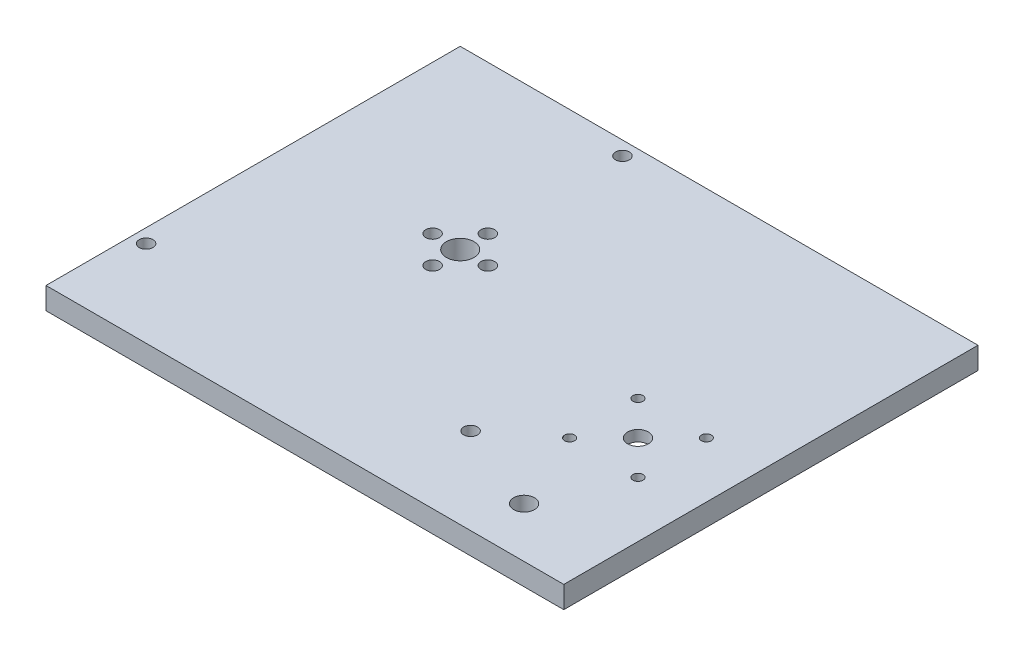
ISO-10303-21;
HEADER;
FILE_DESCRIPTION(('STEP AP214'),'2;1');
FILE_NAME('part.step','',(''),(''),'','','');
FILE_SCHEMA(('AUTOMOTIVE_DESIGN { 1 0 10303 214 1 1 1 1 }'));
ENDSEC;
DATA;
#1=APPLICATION_CONTEXT('core data for automotive mechanical design processes');
#2=APPLICATION_PROTOCOL_DEFINITION('international standard','automotive_design',2000,#1);
#3=PRODUCT_CONTEXT('',#1,'mechanical');
#4=PRODUCT('Part','Part','',(#3));
#5=PRODUCT_RELATED_PRODUCT_CATEGORY('part','',(#4));
#6=PRODUCT_DEFINITION_FORMATION('','',#4);
#7=PRODUCT_DEFINITION_CONTEXT('part definition',#1,'design');
#8=PRODUCT_DEFINITION('design','',#6,#7);
#9=PRODUCT_DEFINITION_SHAPE('','',#8);
#10=(LENGTH_UNIT() NAMED_UNIT(*) SI_UNIT(.MILLI.,.METRE.));
#11=(NAMED_UNIT(*) PLANE_ANGLE_UNIT() SI_UNIT($,.RADIAN.));
#12=(NAMED_UNIT(*) SI_UNIT($,.STERADIAN.) SOLID_ANGLE_UNIT());
#13=UNCERTAINTY_MEASURE_WITH_UNIT(LENGTH_MEASURE(1.E-05),#10,'distance_accuracy_value','');
#14=(GEOMETRIC_REPRESENTATION_CONTEXT(3) GLOBAL_UNCERTAINTY_ASSIGNED_CONTEXT((#13)) GLOBAL_UNIT_ASSIGNED_CONTEXT((#10,
#11,#12)) REPRESENTATION_CONTEXT('',''));
#15=CARTESIAN_POINT('',(0.,0.,0.));
#16=DIRECTION('',(0.,0.,1.));
#17=DIRECTION('',(1.,0.,0.));
#18=AXIS2_PLACEMENT_3D('',#15,#16,#17);
#19=CARTESIAN_POINT('',(124.,-3.65,-47.5));
#20=DIRECTION('',(0.,1.,0.));
#21=DIRECTION('',(0.,0.,1.));
#22=AXIS2_PLACEMENT_3D('',#19,#20,#21);
#23=CYLINDRICAL_SURFACE('',#22,2.99999999999999);
#24=CARTESIAN_POINT('',(124.,6.35,-47.5));
#25=DIRECTION('',(0.,1.,0.));
#26=DIRECTION('',(0.,0.,1.));
#27=AXIS2_PLACEMENT_3D('',#24,#25,#26);
#28=CIRCLE('',#27,2.99999999999999);
#29=CARTESIAN_POINT('',(124.,6.35,-44.5));
#30=VERTEX_POINT('',#29);
#31=EDGE_CURVE('E243',#30,#30,#28,.T.);
#32=ORIENTED_EDGE('',*,*,#31,.T.);
#33=EDGE_LOOP('',(#32));
#34=FACE_BOUND('',#33,.T.);
#35=CARTESIAN_POINT('',(124.,3.21,-47.5));
#36=DIRECTION('',(0.,-1.,0.));
#37=DIRECTION('',(0.,0.,-1.));
#38=AXIS2_PLACEMENT_3D('',#35,#36,#37);
#39=CIRCLE('',#38,2.99999999999999);
#40=CARTESIAN_POINT('',(124.,3.21,-50.5));
#41=VERTEX_POINT('',#40);
#42=EDGE_CURVE('E42',#41,#41,#39,.F.);
#43=ORIENTED_EDGE('',*,*,#42,.F.);
#44=EDGE_LOOP('',(#43));
#45=FACE_BOUND('',#44,.T.);
#46=ADVANCED_FACE('F38',(#34,#45),#23,.F.);
#47=CARTESIAN_POINT('',(0.,6.35,0.));
#48=DIRECTION('',(1.,0.,0.));
#49=DIRECTION('',(0.,0.,-1.));
#50=AXIS2_PLACEMENT_3D('',#47,#48,#49);
#51=PLANE('',#50);
#52=DIRECTION('',(0.,0.,1.));
#53=VECTOR('',#52,1.);
#54=CARTESIAN_POINT('',(0.,0.,0.));
#55=LINE('',#54,#53);
#56=CARTESIAN_POINT('',(0.,0.,-120.));
#57=VERTEX_POINT('',#56);
#58=CARTESIAN_POINT('',(0.,0.,0.));
#59=VERTEX_POINT('',#58);
#60=EDGE_CURVE('E110',#57,#59,#55,.T.);
#61=ORIENTED_EDGE('',*,*,#60,.T.);
#62=DIRECTION('',(0.,-1.,0.));
#63=VECTOR('',#62,1.);
#64=CARTESIAN_POINT('',(0.,6.35,0.));
#65=LINE('',#64,#63);
#66=CARTESIAN_POINT('',(0.,6.35,0.));
#67=VERTEX_POINT('',#66);
#68=EDGE_CURVE('E11',#67,#59,#65,.T.);
#69=ORIENTED_EDGE('',*,*,#68,.F.);
#70=DIRECTION('',(0.,0.,1.));
#71=VECTOR('',#70,1.);
#72=CARTESIAN_POINT('',(0.,6.35,0.));
#73=LINE('',#72,#71);
#74=CARTESIAN_POINT('',(0.,6.35,-120.));
#75=VERTEX_POINT('',#74);
#76=EDGE_CURVE('E93',#75,#67,#73,.T.);
#77=ORIENTED_EDGE('',*,*,#76,.F.);
#78=DIRECTION('',(0.,-1.,0.));
#79=VECTOR('',#78,1.);
#80=CARTESIAN_POINT('',(0.,6.35,-120.));
#81=LINE('',#80,#79);
#82=EDGE_CURVE('E106',#75,#57,#81,.T.);
#83=ORIENTED_EDGE('',*,*,#82,.T.);
#84=EDGE_LOOP('',(#61,#69,#77,#83));
#85=FACE_BOUND('',#84,.T.);
#86=ADVANCED_FACE('F40',(#85),#51,.F.);
#87=CARTESIAN_POINT('',(0.,6.35,0.));
#88=DIRECTION('',(0.,0.,-1.));
#89=DIRECTION('',(-1.,0.,0.));
#90=AXIS2_PLACEMENT_3D('',#87,#88,#89);
#91=PLANE('',#90);
#92=DIRECTION('',(1.,0.,0.));
#93=VECTOR('',#92,1.);
#94=CARTESIAN_POINT('',(0.,0.,0.));
#95=LINE('',#94,#93);
#96=CARTESIAN_POINT('',(150.,0.,0.));
#97=VERTEX_POINT('',#96);
#98=EDGE_CURVE('E98',#59,#97,#95,.T.);
#99=ORIENTED_EDGE('',*,*,#98,.T.);
#100=DIRECTION('',(0.,-1.,0.));
#101=VECTOR('',#100,1.);
#102=CARTESIAN_POINT('',(150.,6.35,0.));
#103=LINE('',#102,#101);
#104=CARTESIAN_POINT('',(150.,6.35,0.));
#105=VERTEX_POINT('',#104);
#106=EDGE_CURVE('E49',#105,#97,#103,.T.);
#107=ORIENTED_EDGE('',*,*,#106,.F.);
#108=DIRECTION('',(1.,0.,0.));
#109=VECTOR('',#108,1.);
#110=CARTESIAN_POINT('',(0.,6.35,0.));
#111=LINE('',#110,#109);
#112=EDGE_CURVE('E88',#67,#105,#111,.T.);
#113=ORIENTED_EDGE('',*,*,#112,.F.);
#114=ORIENTED_EDGE('',*,*,#68,.T.);
#115=EDGE_LOOP('',(#99,#107,#113,#114));
#116=FACE_BOUND('',#115,.T.);
#117=ADVANCED_FACE('F97',(#116),#91,.F.);
#118=CARTESIAN_POINT('',(150.,6.35,0.));
#119=DIRECTION('',(-1.,0.,0.));
#120=DIRECTION('',(0.,0.,1.));
#121=AXIS2_PLACEMENT_3D('',#118,#119,#120);
#122=PLANE('',#121);
#123=DIRECTION('',(0.,0.,-1.));
#124=VECTOR('',#123,1.);
#125=CARTESIAN_POINT('',(150.,0.,0.));
#126=LINE('',#125,#124);
#127=CARTESIAN_POINT('',(150.,0.,-120.));
#128=VERTEX_POINT('',#127);
#129=EDGE_CURVE('E75',#97,#128,#126,.T.);
#130=ORIENTED_EDGE('',*,*,#129,.T.);
#131=DIRECTION('',(0.,-1.,0.));
#132=VECTOR('',#131,1.);
#133=CARTESIAN_POINT('',(150.,6.35,-120.));
#134=LINE('',#133,#132);
#135=CARTESIAN_POINT('',(150.,6.35,-120.));
#136=VERTEX_POINT('',#135);
#137=EDGE_CURVE('E100',#136,#128,#134,.T.);
#138=ORIENTED_EDGE('',*,*,#137,.F.);
#139=DIRECTION('',(0.,0.,-1.));
#140=VECTOR('',#139,1.);
#141=CARTESIAN_POINT('',(150.,6.35,0.));
#142=LINE('',#141,#140);
#143=EDGE_CURVE('E91',#105,#136,#142,.T.);
#144=ORIENTED_EDGE('',*,*,#143,.F.);
#145=ORIENTED_EDGE('',*,*,#106,.T.);
#146=EDGE_LOOP('',(#130,#138,#144,#145));
#147=FACE_BOUND('',#146,.T.);
#148=ADVANCED_FACE('F102',(#147),#122,.F.);
#149=CARTESIAN_POINT('',(0.,6.35,-120.));
#150=DIRECTION('',(0.,0.,1.));
#151=DIRECTION('',(1.,0.,0.));
#152=AXIS2_PLACEMENT_3D('',#149,#150,#151);
#153=PLANE('',#152);
#154=DIRECTION('',(-1.,0.,0.));
#155=VECTOR('',#154,1.);
#156=CARTESIAN_POINT('',(0.,0.,-120.));
#157=LINE('',#156,#155);
#158=EDGE_CURVE('E81',#128,#57,#157,.T.);
#159=ORIENTED_EDGE('',*,*,#158,.T.);
#160=ORIENTED_EDGE('',*,*,#82,.F.);
#161=DIRECTION('',(-1.,0.,0.));
#162=VECTOR('',#161,1.);
#163=CARTESIAN_POINT('',(0.,6.35,-120.));
#164=LINE('',#163,#162);
#165=EDGE_CURVE('E58',#136,#75,#164,.T.);
#166=ORIENTED_EDGE('',*,*,#165,.F.);
#167=ORIENTED_EDGE('',*,*,#137,.T.);
#168=EDGE_LOOP('',(#159,#160,#166,#167));
#169=FACE_BOUND('',#168,.T.);
#170=ADVANCED_FACE('F188',(#169),#153,.F.);
#171=CARTESIAN_POINT('',(0.,6.35,0.));
#172=DIRECTION('',(0.,-1.,0.));
#173=DIRECTION('',(0.,0.,-1.));
#174=AXIS2_PLACEMENT_3D('',#171,#172,#173);
#175=PLANE('',#174);
#176=CARTESIAN_POINT('',(114.100505063388,6.35,-57.3994949366116));
#177=DIRECTION('',(0.,1.,0.));
#178=DIRECTION('',(0.,0.,1.));
#179=AXIS2_PLACEMENT_3D('',#176,#177,#178);
#180=CIRCLE('',#179,1.44999999999998);
#181=CARTESIAN_POINT('',(114.100505063388,6.35,-55.9494949366116));
#182=VERTEX_POINT('',#181);
#183=EDGE_CURVE('E295',#182,#182,#180,.T.);
#184=ORIENTED_EDGE('',*,*,#183,.F.);
#185=EDGE_LOOP('',(#184));
#186=FACE_BOUND('',#185,.T.);
#187=CARTESIAN_POINT('',(133.899494936612,6.35,-37.6005050633883));
#188=DIRECTION('',(0.,1.,0.));
#189=DIRECTION('',(0.,0.,1.));
#190=AXIS2_PLACEMENT_3D('',#187,#188,#189);
#191=CIRCLE('',#190,1.45);
#192=CARTESIAN_POINT('',(133.899494936612,6.35,-36.1505050633883));
#193=VERTEX_POINT('',#192);
#194=EDGE_CURVE('E303',#193,#193,#191,.T.);
#195=ORIENTED_EDGE('',*,*,#194,.F.);
#196=EDGE_LOOP('',(#195));
#197=FACE_BOUND('',#196,.T.);
#198=CARTESIAN_POINT('',(114.100505063388,6.35,-37.6005050633883));
#199=DIRECTION('',(0.,1.,0.));
#200=DIRECTION('',(0.,0.,1.));
#201=AXIS2_PLACEMENT_3D('',#198,#199,#200);
#202=CIRCLE('',#201,1.44999999999998);
#203=CARTESIAN_POINT('',(114.100505063388,6.35,-36.1505050633883));
#204=VERTEX_POINT('',#203);
#205=EDGE_CURVE('E287',#204,#204,#202,.T.);
#206=ORIENTED_EDGE('',*,*,#205,.F.);
#207=EDGE_LOOP('',(#206));
#208=FACE_BOUND('',#207,.T.);
#209=CARTESIAN_POINT('',(133.899494936612,6.35,-57.3994949366116));
#210=DIRECTION('',(0.,1.,0.));
#211=DIRECTION('',(0.,0.,1.));
#212=AXIS2_PLACEMENT_3D('',#209,#210,#211);
#213=CIRCLE('',#212,1.45);
#214=CARTESIAN_POINT('',(133.899494936612,6.35,-55.9494949366116));
#215=VERTEX_POINT('',#214);
#216=EDGE_CURVE('E283',#215,#215,#213,.T.);
#217=ORIENTED_EDGE('',*,*,#216,.F.);
#218=EDGE_LOOP('',(#217));
#219=FACE_BOUND('',#218,.T.);
#220=CARTESIAN_POINT('',(51.,6.35,-116.));
#221=DIRECTION('',(0.,1.,0.));
#222=DIRECTION('',(0.,0.,1.));
#223=AXIS2_PLACEMENT_3D('',#220,#221,#222);
#224=CIRCLE('',#223,2.);
#225=CARTESIAN_POINT('',(51.,6.35,-114.));
#226=VERTEX_POINT('',#225);
#227=EDGE_CURVE('E130',#226,#226,#224,.T.);
#228=ORIENTED_EDGE('',*,*,#227,.F.);
#229=EDGE_LOOP('',(#228));
#230=FACE_BOUND('',#229,.T.);
#231=CARTESIAN_POINT('',(51.0000000000001,6.35,-60.9999999999999));
#232=DIRECTION('',(0.,1.,0.));
#233=DIRECTION('',(0.,0.,1.));
#234=AXIS2_PLACEMENT_3D('',#231,#232,#233);
#235=CIRCLE('',#234,2.);
#236=CARTESIAN_POINT('',(51.0000000000001,6.35,-58.9999999999999));
#237=VERTEX_POINT('',#236);
#238=EDGE_CURVE('E252',#237,#237,#235,.T.);
#239=ORIENTED_EDGE('',*,*,#238,.F.);
#240=EDGE_LOOP('',(#239));
#241=FACE_BOUND('',#240,.T.);
#242=CARTESIAN_POINT('',(51.,6.35,-76.9999999999999));
#243=DIRECTION('',(0.,1.,0.));
#244=DIRECTION('',(0.,0.,1.));
#245=AXIS2_PLACEMENT_3D('',#242,#243,#244);
#246=CIRCLE('',#245,1.99999999999999);
#247=CARTESIAN_POINT('',(51.,6.35,-74.9999999999999));
#248=VERTEX_POINT('',#247);
#249=EDGE_CURVE('E237',#248,#248,#246,.T.);
#250=ORIENTED_EDGE('',*,*,#249,.F.);
#251=EDGE_LOOP('',(#250));
#252=FACE_BOUND('',#251,.T.);
#253=CARTESIAN_POINT('',(43.,6.35,-68.9999999999998));
#254=DIRECTION('',(0.,1.,0.));
#255=DIRECTION('',(0.,0.,1.));
#256=AXIS2_PLACEMENT_3D('',#253,#254,#255);
#257=CIRCLE('',#256,2.);
#258=CARTESIAN_POINT('',(43.,6.35,-66.9999999999998));
#259=VERTEX_POINT('',#258);
#260=EDGE_CURVE('E234',#259,#259,#257,.T.);
#261=ORIENTED_EDGE('',*,*,#260,.F.);
#262=EDGE_LOOP('',(#261));
#263=FACE_BOUND('',#262,.T.);
#264=CARTESIAN_POINT('',(51.,6.35,-68.9999999999999));
#265=DIRECTION('',(0.,1.,0.));
#266=DIRECTION('',(0.,0.,1.));
#267=AXIS2_PLACEMENT_3D('',#264,#265,#266);
#268=CIRCLE('',#267,4.00000000000001);
#269=CARTESIAN_POINT('',(51.,6.35,-64.9999999999999));
#270=VERTEX_POINT('',#269);
#271=EDGE_CURVE('E238',#270,#270,#268,.T.);
#272=ORIENTED_EDGE('',*,*,#271,.F.);
#273=EDGE_LOOP('',(#272));
#274=FACE_BOUND('',#273,.T.);
#275=CARTESIAN_POINT('',(59.,6.35,-68.9999999999999));
#276=DIRECTION('',(0.,1.,0.));
#277=DIRECTION('',(0.,0.,1.));
#278=AXIS2_PLACEMENT_3D('',#275,#276,#277);
#279=CIRCLE('',#278,2.);
#280=CARTESIAN_POINT('',(59.,6.35,-66.9999999999999));
#281=VERTEX_POINT('',#280);
#282=EDGE_CURVE('E246',#281,#281,#279,.T.);
#283=ORIENTED_EDGE('',*,*,#282,.F.);
#284=EDGE_LOOP('',(#283));
#285=FACE_BOUND('',#284,.T.);
#286=ORIENTED_EDGE('',*,*,#31,.F.);
#287=EDGE_LOOP('',(#286));
#288=FACE_BOUND('',#287,.T.);
#289=CARTESIAN_POINT('',(124.,6.35,-14.5));
#290=DIRECTION('',(0.,1.,0.));
#291=DIRECTION('',(0.,0.,1.));
#292=AXIS2_PLACEMENT_3D('',#289,#290,#291);
#293=CIRCLE('',#292,2.99999999999999);
#294=CARTESIAN_POINT('',(124.,6.35,-11.5));
#295=VERTEX_POINT('',#294);
#296=EDGE_CURVE('E256',#295,#295,#293,.T.);
#297=ORIENTED_EDGE('',*,*,#296,.F.);
#298=EDGE_LOOP('',(#297));
#299=FACE_BOUND('',#298,.T.);
#300=CARTESIAN_POINT('',(98.,6.35,-25.));
#301=DIRECTION('',(0.,1.,0.));
#302=DIRECTION('',(0.,0.,1.));
#303=AXIS2_PLACEMENT_3D('',#300,#301,#302);
#304=CIRCLE('',#303,2.);
#305=CARTESIAN_POINT('',(98.,6.35,-23.));
#306=VERTEX_POINT('',#305);
#307=EDGE_CURVE('E260',#306,#306,#304,.T.);
#308=ORIENTED_EDGE('',*,*,#307,.F.);
#309=EDGE_LOOP('',(#308));
#310=FACE_BOUND('',#309,.T.);
#311=CARTESIAN_POINT('',(4.00000000000002,6.35,-25.));
#312=DIRECTION('',(0.,1.,0.));
#313=DIRECTION('',(0.,0.,1.));
#314=AXIS2_PLACEMENT_3D('',#311,#312,#313);
#315=CIRCLE('',#314,2.);
#316=CARTESIAN_POINT('',(4.00000000000002,6.35,-23.));
#317=VERTEX_POINT('',#316);
#318=EDGE_CURVE('E264',#317,#317,#315,.T.);
#319=ORIENTED_EDGE('',*,*,#318,.F.);
#320=EDGE_LOOP('',(#319));
#321=FACE_BOUND('',#320,.T.);
#322=ORIENTED_EDGE('',*,*,#76,.T.);
#323=ORIENTED_EDGE('',*,*,#112,.T.);
#324=ORIENTED_EDGE('',*,*,#143,.T.);
#325=ORIENTED_EDGE('',*,*,#165,.T.);
#326=EDGE_LOOP('',(#322,#323,#324,#325));
#327=FACE_BOUND('',#326,.T.);
#328=ADVANCED_FACE('F89',(#186,#197,#208,#219,#230,#241,#252,#263,#274,#285,#288,#299,#310,#321,
#327),#175,.F.);
#329=CARTESIAN_POINT('',(0.,0.,0.));
#330=DIRECTION('',(0.,-1.,0.));
#331=DIRECTION('',(0.,0.,-1.));
#332=AXIS2_PLACEMENT_3D('',#329,#330,#331);
#333=PLANE('',#332);
#334=CARTESIAN_POINT('',(114.100505063388,0.,-57.3994949366116));
#335=DIRECTION('',(0.,1.,0.));
#336=DIRECTION('',(0.,0.,1.));
#337=AXIS2_PLACEMENT_3D('',#334,#335,#336);
#338=CIRCLE('',#337,1.44999999999998);
#339=CARTESIAN_POINT('',(114.100505063388,0.,-55.9494949366116));
#340=VERTEX_POINT('',#339);
#341=EDGE_CURVE('E291',#340,#340,#338,.T.);
#342=ORIENTED_EDGE('',*,*,#341,.T.);
#343=EDGE_LOOP('',(#342));
#344=FACE_BOUND('',#343,.T.);
#345=CARTESIAN_POINT('',(133.899494936612,0.,-37.6005050633883));
#346=DIRECTION('',(0.,1.,0.));
#347=DIRECTION('',(0.,0.,1.));
#348=AXIS2_PLACEMENT_3D('',#345,#346,#347);
#349=CIRCLE('',#348,1.45);
#350=CARTESIAN_POINT('',(133.899494936612,0.,-36.1505050633883));
#351=VERTEX_POINT('',#350);
#352=EDGE_CURVE('E299',#351,#351,#349,.T.);
#353=ORIENTED_EDGE('',*,*,#352,.T.);
#354=EDGE_LOOP('',(#353));
#355=FACE_BOUND('',#354,.T.);
#356=CARTESIAN_POINT('',(114.100505063388,0.,-37.6005050633883));
#357=DIRECTION('',(0.,1.,0.));
#358=DIRECTION('',(0.,0.,1.));
#359=AXIS2_PLACEMENT_3D('',#356,#357,#358);
#360=CIRCLE('',#359,1.44999999999998);
#361=CARTESIAN_POINT('',(114.100505063388,0.,-36.1505050633883));
#362=VERTEX_POINT('',#361);
#363=EDGE_CURVE('E307',#362,#362,#360,.T.);
#364=ORIENTED_EDGE('',*,*,#363,.T.);
#365=EDGE_LOOP('',(#364));
#366=FACE_BOUND('',#365,.T.);
#367=CARTESIAN_POINT('',(133.899494936612,0.,-57.3994949366116));
#368=DIRECTION('',(0.,1.,0.));
#369=DIRECTION('',(0.,0.,1.));
#370=AXIS2_PLACEMENT_3D('',#367,#368,#369);
#371=CIRCLE('',#370,1.45);
#372=CARTESIAN_POINT('',(133.899494936612,0.,-55.9494949366116));
#373=VERTEX_POINT('',#372);
#374=EDGE_CURVE('E279',#373,#373,#371,.T.);
#375=ORIENTED_EDGE('',*,*,#374,.T.);
#376=EDGE_LOOP('',(#375));
#377=FACE_BOUND('',#376,.T.);
#378=CARTESIAN_POINT('',(124.,0.,-47.5));
#379=DIRECTION('',(0.,-1.,0.));
#380=DIRECTION('',(0.,0.,-1.));
#381=AXIS2_PLACEMENT_3D('',#378,#379,#380);
#382=CIRCLE('',#381,11.);
#383=CARTESIAN_POINT('',(124.,0.,-58.5));
#384=VERTEX_POINT('',#383);
#385=EDGE_CURVE('E274',#384,#384,#382,.T.);
#386=ORIENTED_EDGE('',*,*,#385,.F.);
#387=EDGE_LOOP('',(#386));
#388=FACE_BOUND('',#387,.T.);
#389=CARTESIAN_POINT('',(51.,0.,-116.));
#390=DIRECTION('',(0.,-1.,0.));
#391=DIRECTION('',(0.,0.,-1.));
#392=AXIS2_PLACEMENT_3D('',#389,#390,#391);
#393=CIRCLE('',#392,2.);
#394=CARTESIAN_POINT('',(51.,0.,-118.));
#395=VERTEX_POINT('',#394);
#396=EDGE_CURVE('E114',#395,#395,#393,.T.);
#397=ORIENTED_EDGE('',*,*,#396,.F.);
#398=EDGE_LOOP('',(#397));
#399=FACE_BOUND('',#398,.T.);
#400=CARTESIAN_POINT('',(51.0000000000001,0.,-60.9999999999999));
#401=DIRECTION('',(0.,-1.,0.));
#402=DIRECTION('',(0.,0.,-1.));
#403=AXIS2_PLACEMENT_3D('',#400,#401,#402);
#404=CIRCLE('',#403,2.);
#405=CARTESIAN_POINT('',(51.0000000000001,0.,-62.9999999999999));
#406=VERTEX_POINT('',#405);
#407=EDGE_CURVE('E154',#406,#406,#404,.T.);
#408=ORIENTED_EDGE('',*,*,#407,.F.);
#409=EDGE_LOOP('',(#408));
#410=FACE_BOUND('',#409,.T.);
#411=CARTESIAN_POINT('',(51.,0.,-76.9999999999999));
#412=DIRECTION('',(0.,-1.,0.));
#413=DIRECTION('',(0.,0.,-1.));
#414=AXIS2_PLACEMENT_3D('',#411,#412,#413);
#415=CIRCLE('',#414,1.99999999999999);
#416=CARTESIAN_POINT('',(51.,0.,-78.9999999999999));
#417=VERTEX_POINT('',#416);
#418=EDGE_CURVE('E150',#417,#417,#415,.T.);
#419=ORIENTED_EDGE('',*,*,#418,.F.);
#420=EDGE_LOOP('',(#419));
#421=FACE_BOUND('',#420,.T.);
#422=CARTESIAN_POINT('',(43.,0.,-68.9999999999998));
#423=DIRECTION('',(0.,-1.,0.));
#424=DIRECTION('',(0.,0.,-1.));
#425=AXIS2_PLACEMENT_3D('',#422,#423,#424);
#426=CIRCLE('',#425,2.);
#427=CARTESIAN_POINT('',(43.,0.,-70.9999999999998));
#428=VERTEX_POINT('',#427);
#429=EDGE_CURVE('E146',#428,#428,#426,.T.);
#430=ORIENTED_EDGE('',*,*,#429,.F.);
#431=EDGE_LOOP('',(#430));
#432=FACE_BOUND('',#431,.T.);
#433=CARTESIAN_POINT('',(51.,0.,-68.9999999999999));
#434=DIRECTION('',(0.,-1.,0.));
#435=DIRECTION('',(0.,0.,-1.));
#436=AXIS2_PLACEMENT_3D('',#433,#434,#435);
#437=CIRCLE('',#436,4.00000000000001);
#438=CARTESIAN_POINT('',(51.,0.,-72.9999999999999));
#439=VERTEX_POINT('',#438);
#440=EDGE_CURVE('E142',#439,#439,#437,.T.);
#441=ORIENTED_EDGE('',*,*,#440,.F.);
#442=EDGE_LOOP('',(#441));
#443=FACE_BOUND('',#442,.T.);
#444=CARTESIAN_POINT('',(59.,0.,-68.9999999999999));
#445=DIRECTION('',(0.,-1.,0.));
#446=DIRECTION('',(0.,0.,-1.));
#447=AXIS2_PLACEMENT_3D('',#444,#445,#446);
#448=CIRCLE('',#447,2.);
#449=CARTESIAN_POINT('',(59.,0.,-70.9999999999999));
#450=VERTEX_POINT('',#449);
#451=EDGE_CURVE('E138',#450,#450,#448,.T.);
#452=ORIENTED_EDGE('',*,*,#451,.F.);
#453=EDGE_LOOP('',(#452));
#454=FACE_BOUND('',#453,.T.);
#455=CARTESIAN_POINT('',(124.,0.,-14.5));
#456=DIRECTION('',(0.,-1.,0.));
#457=DIRECTION('',(0.,0.,-1.));
#458=AXIS2_PLACEMENT_3D('',#455,#456,#457);
#459=CIRCLE('',#458,2.99999999999999);
#460=CARTESIAN_POINT('',(124.,0.,-17.5));
#461=VERTEX_POINT('',#460);
#462=EDGE_CURVE('E134',#461,#461,#459,.T.);
#463=ORIENTED_EDGE('',*,*,#462,.F.);
#464=EDGE_LOOP('',(#463));
#465=FACE_BOUND('',#464,.T.);
#466=CARTESIAN_POINT('',(98.,0.,-25.));
#467=DIRECTION('',(0.,-1.,0.));
#468=DIRECTION('',(0.,0.,-1.));
#469=AXIS2_PLACEMENT_3D('',#466,#467,#468);
#470=CIRCLE('',#469,2.);
#471=CARTESIAN_POINT('',(98.,0.,-27.));
#472=VERTEX_POINT('',#471);
#473=EDGE_CURVE('E129',#472,#472,#470,.T.);
#474=ORIENTED_EDGE('',*,*,#473,.F.);
#475=EDGE_LOOP('',(#474));
#476=FACE_BOUND('',#475,.T.);
#477=CARTESIAN_POINT('',(4.00000000000002,0.,-25.));
#478=DIRECTION('',(0.,-1.,0.));
#479=DIRECTION('',(0.,0.,-1.));
#480=AXIS2_PLACEMENT_3D('',#477,#478,#479);
#481=CIRCLE('',#480,2.);
#482=CARTESIAN_POINT('',(4.00000000000002,0.,-27.));
#483=VERTEX_POINT('',#482);
#484=EDGE_CURVE('E125',#483,#483,#481,.T.);
#485=ORIENTED_EDGE('',*,*,#484,.F.);
#486=EDGE_LOOP('',(#485));
#487=FACE_BOUND('',#486,.T.);
#488=ORIENTED_EDGE('',*,*,#60,.F.);
#489=ORIENTED_EDGE('',*,*,#158,.F.);
#490=ORIENTED_EDGE('',*,*,#129,.F.);
#491=ORIENTED_EDGE('',*,*,#98,.F.);
#492=EDGE_LOOP('',(#488,#489,#490,#491));
#493=FACE_BOUND('',#492,.T.);
#494=ADVANCED_FACE('F164',(#344,#355,#366,#377,#388,#399,#410,#421,#432,#443,#454,#465,#476,
#487,#493),#333,.T.);
#495=CARTESIAN_POINT('',(4.00000000000002,-3.65,-25.));
#496=DIRECTION('',(0.,1.,0.));
#497=DIRECTION('',(0.,0.,1.));
#498=AXIS2_PLACEMENT_3D('',#495,#496,#497);
#499=CYLINDRICAL_SURFACE('',#498,2.);
#500=ORIENTED_EDGE('',*,*,#484,.T.);
#501=EDGE_LOOP('',(#500));
#502=FACE_BOUND('',#501,.T.);
#503=ORIENTED_EDGE('',*,*,#318,.T.);
#504=EDGE_LOOP('',(#503));
#505=FACE_BOUND('',#504,.T.);
#506=ADVANCED_FACE('F167',(#502,#505),#499,.F.);
#507=CARTESIAN_POINT('',(98.,-3.65,-25.));
#508=DIRECTION('',(0.,1.,0.));
#509=DIRECTION('',(0.,0.,1.));
#510=AXIS2_PLACEMENT_3D('',#507,#508,#509);
#511=CYLINDRICAL_SURFACE('',#510,2.);
#512=ORIENTED_EDGE('',*,*,#473,.T.);
#513=EDGE_LOOP('',(#512));
#514=FACE_BOUND('',#513,.T.);
#515=ORIENTED_EDGE('',*,*,#307,.T.);
#516=EDGE_LOOP('',(#515));
#517=FACE_BOUND('',#516,.T.);
#518=ADVANCED_FACE('F338',(#514,#517),#511,.F.);
#519=CARTESIAN_POINT('',(124.,-3.65,-14.5));
#520=DIRECTION('',(0.,1.,0.));
#521=DIRECTION('',(0.,0.,1.));
#522=AXIS2_PLACEMENT_3D('',#519,#520,#521);
#523=CYLINDRICAL_SURFACE('',#522,2.99999999999999);
#524=ORIENTED_EDGE('',*,*,#462,.T.);
#525=EDGE_LOOP('',(#524));
#526=FACE_BOUND('',#525,.T.);
#527=ORIENTED_EDGE('',*,*,#296,.T.);
#528=EDGE_LOOP('',(#527));
#529=FACE_BOUND('',#528,.T.);
#530=ADVANCED_FACE('F211',(#526,#529),#523,.F.);
#531=CARTESIAN_POINT('',(59.,-3.65,-68.9999999999999));
#532=DIRECTION('',(0.,1.,0.));
#533=DIRECTION('',(0.,0.,1.));
#534=AXIS2_PLACEMENT_3D('',#531,#532,#533);
#535=CYLINDRICAL_SURFACE('',#534,2.);
#536=ORIENTED_EDGE('',*,*,#451,.T.);
#537=EDGE_LOOP('',(#536));
#538=FACE_BOUND('',#537,.T.);
#539=ORIENTED_EDGE('',*,*,#282,.T.);
#540=EDGE_LOOP('',(#539));
#541=FACE_BOUND('',#540,.T.);
#542=ADVANCED_FACE('F217',(#538,#541),#535,.F.);
#543=CARTESIAN_POINT('',(51.,-3.65,-68.9999999999999));
#544=DIRECTION('',(0.,1.,0.));
#545=DIRECTION('',(0.,0.,1.));
#546=AXIS2_PLACEMENT_3D('',#543,#544,#545);
#547=CYLINDRICAL_SURFACE('',#546,4.00000000000001);
#548=ORIENTED_EDGE('',*,*,#440,.T.);
#549=EDGE_LOOP('',(#548));
#550=FACE_BOUND('',#549,.T.);
#551=ORIENTED_EDGE('',*,*,#271,.T.);
#552=EDGE_LOOP('',(#551));
#553=FACE_BOUND('',#552,.T.);
#554=ADVANCED_FACE('F213',(#550,#553),#547,.F.);
#555=CARTESIAN_POINT('',(43.,-3.65,-68.9999999999998));
#556=DIRECTION('',(0.,1.,0.));
#557=DIRECTION('',(0.,0.,1.));
#558=AXIS2_PLACEMENT_3D('',#555,#556,#557);
#559=CYLINDRICAL_SURFACE('',#558,2.);
#560=ORIENTED_EDGE('',*,*,#429,.T.);
#561=EDGE_LOOP('',(#560));
#562=FACE_BOUND('',#561,.T.);
#563=ORIENTED_EDGE('',*,*,#260,.T.);
#564=EDGE_LOOP('',(#563));
#565=FACE_BOUND('',#564,.T.);
#566=ADVANCED_FACE('F216',(#562,#565),#559,.F.);
#567=CARTESIAN_POINT('',(51.,-3.65,-76.9999999999999));
#568=DIRECTION('',(0.,1.,0.));
#569=DIRECTION('',(0.,0.,1.));
#570=AXIS2_PLACEMENT_3D('',#567,#568,#569);
#571=CYLINDRICAL_SURFACE('',#570,1.99999999999999);
#572=ORIENTED_EDGE('',*,*,#418,.T.);
#573=EDGE_LOOP('',(#572));
#574=FACE_BOUND('',#573,.T.);
#575=ORIENTED_EDGE('',*,*,#249,.T.);
#576=EDGE_LOOP('',(#575));
#577=FACE_BOUND('',#576,.T.);
#578=ADVANCED_FACE('F222',(#574,#577),#571,.F.);
#579=CARTESIAN_POINT('',(51.0000000000001,-3.65,-60.9999999999999));
#580=DIRECTION('',(0.,1.,0.));
#581=DIRECTION('',(0.,0.,1.));
#582=AXIS2_PLACEMENT_3D('',#579,#580,#581);
#583=CYLINDRICAL_SURFACE('',#582,2.);
#584=ORIENTED_EDGE('',*,*,#407,.T.);
#585=EDGE_LOOP('',(#584));
#586=FACE_BOUND('',#585,.T.);
#587=ORIENTED_EDGE('',*,*,#238,.T.);
#588=EDGE_LOOP('',(#587));
#589=FACE_BOUND('',#588,.T.);
#590=ADVANCED_FACE('F225',(#586,#589),#583,.F.);
#591=CARTESIAN_POINT('',(51.,-3.65,-116.));
#592=DIRECTION('',(0.,1.,0.));
#593=DIRECTION('',(0.,0.,1.));
#594=AXIS2_PLACEMENT_3D('',#591,#592,#593);
#595=CYLINDRICAL_SURFACE('',#594,2.);
#596=ORIENTED_EDGE('',*,*,#396,.T.);
#597=EDGE_LOOP('',(#596));
#598=FACE_BOUND('',#597,.T.);
#599=ORIENTED_EDGE('',*,*,#227,.T.);
#600=EDGE_LOOP('',(#599));
#601=FACE_BOUND('',#600,.T.);
#602=ADVANCED_FACE('F161',(#598,#601),#595,.F.);
#603=CARTESIAN_POINT('',(124.,3.21,-47.5));
#604=DIRECTION('',(0.,-1.,0.));
#605=DIRECTION('',(0.,0.,-1.));
#606=AXIS2_PLACEMENT_3D('',#603,#604,#605);
#607=PLANE('',#606);
#608=CARTESIAN_POINT('',(124.,3.21,-47.5));
#609=DIRECTION('',(0.,-1.,0.));
#610=DIRECTION('',(0.,0.,-1.));
#611=AXIS2_PLACEMENT_3D('',#608,#609,#610);
#612=CIRCLE('',#611,11.);
#613=CARTESIAN_POINT('',(124.,3.21,-58.5));
#614=VERTEX_POINT('',#613);
#615=EDGE_CURVE('E278',#614,#614,#612,.T.);
#616=ORIENTED_EDGE('',*,*,#615,.T.);
#617=EDGE_LOOP('',(#616));
#618=FACE_BOUND('',#617,.T.);
#619=ORIENTED_EDGE('',*,*,#42,.T.);
#620=EDGE_LOOP('',(#619));
#621=FACE_BOUND('',#620,.T.);
#622=ADVANCED_FACE('F351',(#618,#621),#607,.T.);
#623=CARTESIAN_POINT('',(124.,3.21,-47.5));
#624=DIRECTION('',(0.,-1.,0.));
#625=DIRECTION('',(0.,0.,-1.));
#626=AXIS2_PLACEMENT_3D('',#623,#624,#625);
#627=CYLINDRICAL_SURFACE('',#626,11.);
#628=CARTESIAN_POINT('',(124.,3.21,-58.5));
#629=CARTESIAN_POINT('',(124.,3.1765625,-58.5));
#630=CARTESIAN_POINT('',(124.,3.143125,-58.5));
#631=CARTESIAN_POINT('',(124.,3.07625,-58.5));
#632=CARTESIAN_POINT('',(124.,3.0428125,-58.5));
#633=CARTESIAN_POINT('',(124.,2.9759375,-58.5));
#634=CARTESIAN_POINT('',(124.,2.9425,-58.5));
#635=CARTESIAN_POINT('',(124.,2.875625,-58.5));
#636=CARTESIAN_POINT('',(124.,2.8421875,-58.5));
#637=CARTESIAN_POINT('',(124.,2.7753125,-58.5));
#638=CARTESIAN_POINT('',(124.,2.741875,-58.5));
#639=CARTESIAN_POINT('',(124.,2.675,-58.5));
#640=CARTESIAN_POINT('',(124.,2.6415625,-58.5));
#641=CARTESIAN_POINT('',(124.,2.5746875,-58.5));
#642=CARTESIAN_POINT('',(124.,2.54125,-58.5));
#643=CARTESIAN_POINT('',(124.,2.474375,-58.5));
#644=CARTESIAN_POINT('',(124.,2.4409375,-58.5));
#645=CARTESIAN_POINT('',(124.,2.3740625,-58.5));
#646=CARTESIAN_POINT('',(124.,2.340625,-58.5));
#647=CARTESIAN_POINT('',(124.,2.27375,-58.5));
#648=CARTESIAN_POINT('',(124.,2.2403125,-58.5));
#649=CARTESIAN_POINT('',(124.,2.1734375,-58.5));
#650=CARTESIAN_POINT('',(124.,2.14,-58.5));
#651=CARTESIAN_POINT('',(124.,2.073125,-58.5));
#652=CARTESIAN_POINT('',(124.,2.0396875,-58.5));
#653=CARTESIAN_POINT('',(124.,1.9728125,-58.5));
#654=CARTESIAN_POINT('',(124.,1.939375,-58.5));
#655=CARTESIAN_POINT('',(124.,1.8725,-58.5));
#656=CARTESIAN_POINT('',(124.,1.8390625,-58.5));
#657=CARTESIAN_POINT('',(124.,1.7721875,-58.5));
#658=CARTESIAN_POINT('',(124.,1.73875,-58.5));
#659=CARTESIAN_POINT('',(124.,1.671875,-58.5));
#660=CARTESIAN_POINT('',(124.,1.6384375,-58.5));
#661=CARTESIAN_POINT('',(124.,1.5715625,-58.5));
#662=CARTESIAN_POINT('',(124.,1.538125,-58.5));
#663=CARTESIAN_POINT('',(124.,1.47125,-58.5));
#664=CARTESIAN_POINT('',(124.,1.4378125,-58.5));
#665=CARTESIAN_POINT('',(124.,1.3709375,-58.5));
#666=CARTESIAN_POINT('',(124.,1.3375,-58.5));
#667=CARTESIAN_POINT('',(124.,1.270625,-58.5));
#668=CARTESIAN_POINT('',(124.,1.2371875,-58.5));
#669=CARTESIAN_POINT('',(124.,1.1703125,-58.5));
#670=CARTESIAN_POINT('',(124.,1.136875,-58.5));
#671=CARTESIAN_POINT('',(124.,1.07,-58.5));
#672=CARTESIAN_POINT('',(124.,1.0365625,-58.5));
#673=CARTESIAN_POINT('',(124.,0.9696875,-58.5));
#674=CARTESIAN_POINT('',(124.,0.93625,-58.5));
#675=CARTESIAN_POINT('',(124.,0.869375,-58.5));
#676=CARTESIAN_POINT('',(124.,0.835937500000001,-58.5));
#677=CARTESIAN_POINT('',(124.,0.769062500000001,-58.5));
#678=CARTESIAN_POINT('',(124.,0.735625000000001,-58.5));
#679=CARTESIAN_POINT('',(124.,0.668750000000001,-58.5));
#680=CARTESIAN_POINT('',(124.,0.635312500000001,-58.5));
#681=CARTESIAN_POINT('',(124.,0.5684375,-58.5));
#682=CARTESIAN_POINT('',(124.,0.535000000000001,-58.5));
#683=CARTESIAN_POINT('',(124.,0.468125000000001,-58.5));
#684=CARTESIAN_POINT('',(124.,0.434687500000001,-58.5));
#685=CARTESIAN_POINT('',(124.,0.367812500000001,-58.5));
#686=CARTESIAN_POINT('',(124.,0.334375,-58.5));
#687=CARTESIAN_POINT('',(124.,0.2675,-58.5));
#688=CARTESIAN_POINT('',(124.,0.2340625,-58.5));
#689=CARTESIAN_POINT('',(124.,0.1671875,-58.5));
#690=CARTESIAN_POINT('',(124.,0.13375,-58.5));
#691=CARTESIAN_POINT('',(124.,0.0668750000000005,-58.5));
#692=CARTESIAN_POINT('',(124.,0.0334375000000005,-58.5));
#693=CARTESIAN_POINT('',(124.,0.,-58.5));
#694=B_SPLINE_CURVE_WITH_KNOTS('',3,(#628,#629,#630,#631,#632,#633,#634,#635,#636,#637,#638,
#639,#640,#641,#642,#643,#644,#645,#646,#647,#648,#649,#650,#651,#652,#653,#654,#655,#656,#657,
#658,#659,#660,#661,#662,#663,#664,#665,#666,#667,#668,#669,#670,#671,#672,#673,#674,#675,#676,
#677,#678,#679,#680,#681,#682,#683,#684,#685,#686,#687,#688,#689,#690,#691,#692,#693),
.UNSPECIFIED.,.F.,.F.,(4,2,2,2,2,2,2,2,2,2,2,2,2,2,2,2,2,2,2,2,2,2,2,2,2,2,2,2,2,2,2,2,4),(0.,
0.1003125,0.200625,0.3009375,0.40125,0.5015625,0.601875,0.7021875,0.8025,0.9028125,1.003125,
1.1034375,1.20375,1.3040625,1.404375,1.5046875,1.605,1.7053125,1.805625,1.9059375,2.00625,
2.1065625,2.206875,2.3071875,2.4075,2.5078125,2.608125,2.7084375,2.80875,2.9090625,3.009375,
3.1096875,3.21),.UNSPECIFIED.);
#695=EDGE_CURVE('BSEAM352',#614,#384,#694,.T.);
#696=ORIENTED_EDGE('',*,*,#615,.F.);
#697=ORIENTED_EDGE('',*,*,#385,.T.);
#698=ORIENTED_EDGE('',*,*,#695,.T.);
#699=ORIENTED_EDGE('',*,*,#695,.F.);
#700=EDGE_LOOP('',(#696,#698,#697,#699));
#701=FACE_BOUND('',#700,.T.);
#702=ADVANCED_FACE('F352',(#701),#627,.F.);
#703=CARTESIAN_POINT('',(133.899494936612,0.,-57.3994949366116));
#704=DIRECTION('',(0.,1.,0.));
#705=DIRECTION('',(0.,0.,1.));
#706=AXIS2_PLACEMENT_3D('',#703,#704,#705);
#707=CYLINDRICAL_SURFACE('',#706,1.45);
#708=ORIENTED_EDGE('',*,*,#374,.F.);
#709=EDGE_LOOP('',(#708));
#710=FACE_BOUND('',#709,.T.);
#711=ORIENTED_EDGE('',*,*,#216,.T.);
#712=EDGE_LOOP('',(#711));
#713=FACE_BOUND('',#712,.T.);
#714=ADVANCED_FACE('F355',(#710,#713),#707,.F.);
#715=CARTESIAN_POINT('',(114.100505063388,0.,-37.6005050633883));
#716=DIRECTION('',(0.,1.,0.));
#717=DIRECTION('',(0.,0.,1.));
#718=AXIS2_PLACEMENT_3D('',#715,#716,#717);
#719=CYLINDRICAL_SURFACE('',#718,1.44999999999998);
#720=ORIENTED_EDGE('',*,*,#363,.F.);
#721=EDGE_LOOP('',(#720));
#722=FACE_BOUND('',#721,.T.);
#723=ORIENTED_EDGE('',*,*,#205,.T.);
#724=EDGE_LOOP('',(#723));
#725=FACE_BOUND('',#724,.T.);
#726=ADVANCED_FACE('F315',(#722,#725),#719,.F.);
#727=CARTESIAN_POINT('',(133.899494936612,0.,-37.6005050633883));
#728=DIRECTION('',(0.,1.,0.));
#729=DIRECTION('',(0.,0.,1.));
#730=AXIS2_PLACEMENT_3D('',#727,#728,#729);
#731=CYLINDRICAL_SURFACE('',#730,1.45);
#732=ORIENTED_EDGE('',*,*,#352,.F.);
#733=EDGE_LOOP('',(#732));
#734=FACE_BOUND('',#733,.T.);
#735=ORIENTED_EDGE('',*,*,#194,.T.);
#736=EDGE_LOOP('',(#735));
#737=FACE_BOUND('',#736,.T.);
#738=ADVANCED_FACE('F366',(#734,#737),#731,.F.);
#739=CARTESIAN_POINT('',(114.100505063388,0.,-57.3994949366116));
#740=DIRECTION('',(0.,1.,0.));
#741=DIRECTION('',(0.,0.,1.));
#742=AXIS2_PLACEMENT_3D('',#739,#740,#741);
#743=CYLINDRICAL_SURFACE('',#742,1.44999999999998);
#744=ORIENTED_EDGE('',*,*,#341,.F.);
#745=EDGE_LOOP('',(#744));
#746=FACE_BOUND('',#745,.T.);
#747=ORIENTED_EDGE('',*,*,#183,.T.);
#748=EDGE_LOOP('',(#747));
#749=FACE_BOUND('',#748,.T.);
#750=ADVANCED_FACE('F363',(#746,#749),#743,.F.);
#751=CLOSED_SHELL('',(#46,#86,#117,#148,#170,#328,#494,#506,#518,#530,#542,#554,#566,#578,#590,
#602,#622,#702,#714,#726,#738,#750));
#752=MANIFOLD_SOLID_BREP('B2',#751);
#753=ADVANCED_BREP_SHAPE_REPRESENTATION('',(#18,#752),#14);
#754=SHAPE_DEFINITION_REPRESENTATION(#9,#753);
ENDSEC;
END-ISO-10303-21;
